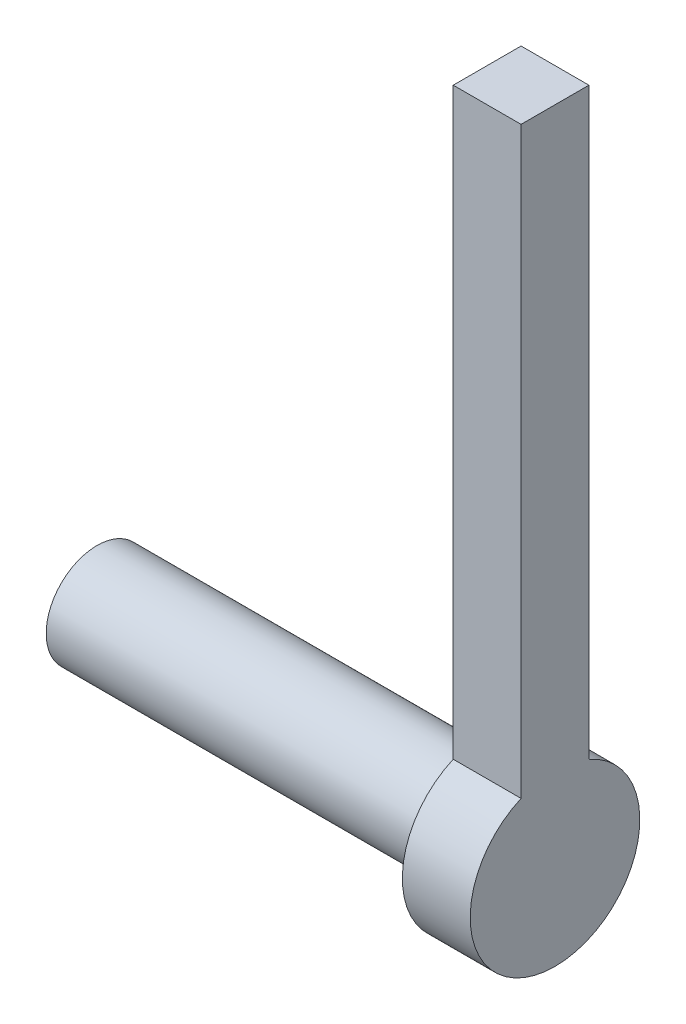
ISO-10303-21;
HEADER;
FILE_DESCRIPTION(('STEP AP214'),'2;1');
FILE_NAME('part.step','',(''),(''),'','','');
FILE_SCHEMA(('AUTOMOTIVE_DESIGN { 1 0 10303 214 1 1 1 1 }'));
ENDSEC;
DATA;
#1=APPLICATION_CONTEXT('core data for automotive mechanical design processes');
#2=APPLICATION_PROTOCOL_DEFINITION('international standard','automotive_design',2000,#1);
#3=PRODUCT_CONTEXT('',#1,'mechanical');
#4=PRODUCT('Part','Part','',(#3));
#5=PRODUCT_RELATED_PRODUCT_CATEGORY('part','',(#4));
#6=PRODUCT_DEFINITION_FORMATION('','',#4);
#7=PRODUCT_DEFINITION_CONTEXT('part definition',#1,'design');
#8=PRODUCT_DEFINITION('design','',#6,#7);
#9=PRODUCT_DEFINITION_SHAPE('','',#8);
#10=(LENGTH_UNIT() NAMED_UNIT(*) SI_UNIT(.MILLI.,.METRE.));
#11=(NAMED_UNIT(*) PLANE_ANGLE_UNIT() SI_UNIT($,.RADIAN.));
#12=(NAMED_UNIT(*) SI_UNIT($,.STERADIAN.) SOLID_ANGLE_UNIT());
#13=UNCERTAINTY_MEASURE_WITH_UNIT(LENGTH_MEASURE(1.E-05),#10,'distance_accuracy_value','');
#14=(GEOMETRIC_REPRESENTATION_CONTEXT(3) GLOBAL_UNCERTAINTY_ASSIGNED_CONTEXT((#13)) GLOBAL_UNIT_ASSIGNED_CONTEXT((#10,
#11,#12)) REPRESENTATION_CONTEXT('',''));
#15=CARTESIAN_POINT('',(0.,0.,0.));
#16=DIRECTION('',(0.,0.,1.));
#17=DIRECTION('',(1.,0.,0.));
#18=AXIS2_PLACEMENT_3D('',#15,#16,#17);
#19=CARTESIAN_POINT('',(-0.5,29.,-10.5));
#20=DIRECTION('',(-1.,0.,0.));
#21=DIRECTION('',(0.,0.,1.));
#22=AXIS2_PLACEMENT_3D('',#19,#20,#21);
#23=CYLINDRICAL_SURFACE('',#22,1.5);
#24=CARTESIAN_POINT('',(-0.5,29.,-10.5));
#25=DIRECTION('',(-1.,0.,0.));
#26=DIRECTION('',(0.,0.,-1.));
#27=AXIS2_PLACEMENT_3D('',#24,#25,#26);
#28=CIRCLE('',#27,1.5);
#29=CARTESIAN_POINT('',(-0.5,29.,-12.));
#30=VERTEX_POINT('',#29);
#31=EDGE_CURVE('E11',#30,#30,#28,.T.);
#32=ORIENTED_EDGE('',*,*,#31,.T.);
#33=EDGE_LOOP('',(#32));
#34=FACE_BOUND('',#33,.T.);
#35=CARTESIAN_POINT('',(-12.,29.,-10.5));
#36=DIRECTION('',(-1.,0.,0.));
#37=DIRECTION('',(0.,0.,-1.));
#38=AXIS2_PLACEMENT_3D('',#35,#36,#37);
#39=CIRCLE('',#38,1.5);
#40=CARTESIAN_POINT('',(-12.,29.,-12.));
#41=VERTEX_POINT('',#40);
#42=EDGE_CURVE('E42',#41,#41,#39,.T.);
#43=ORIENTED_EDGE('',*,*,#42,.F.);
#44=EDGE_LOOP('',(#43));
#45=FACE_BOUND('',#44,.T.);
#46=ADVANCED_FACE('F41',(#34,#45),#23,.T.);
#47=CARTESIAN_POINT('',(-12.,29.,-10.5));
#48=DIRECTION('',(1.,0.,0.));
#49=DIRECTION('',(0.,0.,-1.));
#50=AXIS2_PLACEMENT_3D('',#47,#48,#49);
#51=PLANE('',#50);
#52=ORIENTED_EDGE('',*,*,#42,.T.);
#53=EDGE_LOOP('',(#52));
#54=FACE_BOUND('',#53,.T.);
#55=ADVANCED_FACE('F121',(#54),#51,.F.);
#56=CARTESIAN_POINT('',(1.5,29.,-10.5));
#57=DIRECTION('',(-1.,0.,0.));
#58=DIRECTION('',(0.,0.,1.));
#59=AXIS2_PLACEMENT_3D('',#56,#57,#58);
#60=CYLINDRICAL_SURFACE('',#59,2.5);
#61=CARTESIAN_POINT('',(-0.5,29.,-10.5));
#62=DIRECTION('',(-1.,0.,0.));
#63=DIRECTION('',(0.,0.,-1.));
#64=AXIS2_PLACEMENT_3D('',#61,#62,#63);
#65=CIRCLE('',#64,2.5);
#66=CARTESIAN_POINT('',(-0.5,31.2912878474779,-11.5));
#67=VERTEX_POINT('',#66);
#68=CARTESIAN_POINT('',(-0.5,31.2912878474779,-9.5));
#69=VERTEX_POINT('',#68);
#70=EDGE_CURVE('E101',#67,#69,#65,.T.);
#71=ORIENTED_EDGE('',*,*,#70,.F.);
#72=DIRECTION('',(-1.,0.,0.));
#73=VECTOR('',#72,1.);
#74=CARTESIAN_POINT('',(1.5,31.2912878474779,-11.5));
#75=LINE('',#74,#73);
#76=CARTESIAN_POINT('',(1.5,31.2912878474779,-11.5));
#77=VERTEX_POINT('',#76);
#78=EDGE_CURVE('E92',#67,#77,#75,.F.);
#79=ORIENTED_EDGE('',*,*,#78,.T.);
#80=CARTESIAN_POINT('',(1.5,29.,-10.5));
#81=DIRECTION('',(-1.,0.,0.));
#82=DIRECTION('',(0.,0.,-1.));
#83=AXIS2_PLACEMENT_3D('',#80,#81,#82);
#84=CIRCLE('',#83,2.5);
#85=CARTESIAN_POINT('',(1.5,31.2912878474779,-9.5));
#86=VERTEX_POINT('',#85);
#87=EDGE_CURVE('E111',#77,#86,#84,.T.);
#88=ORIENTED_EDGE('',*,*,#87,.T.);
#89=DIRECTION('',(-1.,0.,0.));
#90=VECTOR('',#89,1.);
#91=CARTESIAN_POINT('',(1.5,31.2912878474779,-9.5));
#92=LINE('',#91,#90);
#93=EDGE_CURVE('E115',#69,#86,#92,.F.);
#94=ORIENTED_EDGE('',*,*,#93,.F.);
#95=EDGE_LOOP('',(#71,#79,#88,#94));
#96=FACE_BOUND('',#95,.T.);
#97=ADVANCED_FACE('F126',(#96),#60,.T.);
#98=CARTESIAN_POINT('',(1.5,29.,-10.5));
#99=DIRECTION('',(1.,0.,0.));
#100=DIRECTION('',(0.,0.,-1.));
#101=AXIS2_PLACEMENT_3D('',#98,#99,#100);
#102=PLANE('',#101);
#103=ORIENTED_EDGE('',*,*,#87,.F.);
#104=DIRECTION('',(0.,-1.,0.));
#105=VECTOR('',#104,1.);
#106=CARTESIAN_POINT('',(1.5,48.5,-11.5));
#107=LINE('',#106,#105);
#108=CARTESIAN_POINT('',(1.5,48.5,-11.5));
#109=VERTEX_POINT('',#108);
#110=EDGE_CURVE('E105',#109,#77,#107,.T.);
#111=ORIENTED_EDGE('',*,*,#110,.F.);
#112=DIRECTION('',(0.,0.,-1.));
#113=VECTOR('',#112,1.);
#114=CARTESIAN_POINT('',(1.5,48.5,-9.5));
#115=LINE('',#114,#113);
#116=CARTESIAN_POINT('',(1.5,48.5,-9.5));
#117=VERTEX_POINT('',#116);
#118=EDGE_CURVE('E96',#117,#109,#115,.T.);
#119=ORIENTED_EDGE('',*,*,#118,.F.);
#120=DIRECTION('',(0.,-1.,0.));
#121=VECTOR('',#120,1.);
#122=CARTESIAN_POINT('',(1.5,48.5,-9.5));
#123=LINE('',#122,#121);
#124=EDGE_CURVE('E54',#117,#86,#123,.T.);
#125=ORIENTED_EDGE('',*,*,#124,.T.);
#126=EDGE_LOOP('',(#103,#111,#119,#125));
#127=FACE_BOUND('',#126,.T.);
#128=ADVANCED_FACE('F132',(#127),#102,.T.);
#129=CARTESIAN_POINT('',(-0.5,29.,-10.5));
#130=DIRECTION('',(1.,0.,0.));
#131=DIRECTION('',(0.,0.,-1.));
#132=AXIS2_PLACEMENT_3D('',#129,#130,#131);
#133=PLANE('',#132);
#134=ORIENTED_EDGE('',*,*,#70,.T.);
#135=DIRECTION('',(0.,1.,0.));
#136=VECTOR('',#135,1.);
#137=CARTESIAN_POINT('',(-0.5,29.,-9.5));
#138=LINE('',#137,#136);
#139=CARTESIAN_POINT('',(-0.5,48.5,-9.5));
#140=VERTEX_POINT('',#139);
#141=EDGE_CURVE('E87',#69,#140,#138,.T.);
#142=ORIENTED_EDGE('',*,*,#141,.T.);
#143=DIRECTION('',(0.,0.,-1.));
#144=VECTOR('',#143,1.);
#145=CARTESIAN_POINT('',(-0.5,48.5,-9.5));
#146=LINE('',#145,#144);
#147=CARTESIAN_POINT('',(-0.5,48.5,-11.5));
#148=VERTEX_POINT('',#147);
#149=EDGE_CURVE('E95',#140,#148,#146,.T.);
#150=ORIENTED_EDGE('',*,*,#149,.T.);
#151=DIRECTION('',(0.,1.,0.));
#152=VECTOR('',#151,1.);
#153=CARTESIAN_POINT('',(-0.5,29.,-11.5));
#154=LINE('',#153,#152);
#155=EDGE_CURVE('E65',#67,#148,#154,.T.);
#156=ORIENTED_EDGE('',*,*,#155,.F.);
#157=EDGE_LOOP('',(#134,#142,#150,#156));
#158=FACE_BOUND('',#157,.T.);
#159=ORIENTED_EDGE('',*,*,#31,.F.);
#160=EDGE_LOOP('',(#159));
#161=FACE_BOUND('',#160,.T.);
#162=ADVANCED_FACE('F98',(#158,#161),#133,.F.);
#163=CARTESIAN_POINT('',(0.,0.,-9.5));
#164=DIRECTION('',(0.,0.,1.));
#165=DIRECTION('',(1.,0.,0.));
#166=AXIS2_PLACEMENT_3D('',#163,#164,#165);
#167=PLANE('',#166);
#168=ORIENTED_EDGE('',*,*,#93,.T.);
#169=ORIENTED_EDGE('',*,*,#124,.F.);
#170=DIRECTION('',(1.,0.,0.));
#171=VECTOR('',#170,1.);
#172=CARTESIAN_POINT('',(-0.5,48.5,-9.5));
#173=LINE('',#172,#171);
#174=EDGE_CURVE('E84',#140,#117,#173,.T.);
#175=ORIENTED_EDGE('',*,*,#174,.F.);
#176=ORIENTED_EDGE('',*,*,#141,.F.);
#177=EDGE_LOOP('',(#168,#169,#175,#176));
#178=FACE_BOUND('',#177,.T.);
#179=ADVANCED_FACE('F85',(#178),#167,.T.);
#180=CARTESIAN_POINT('',(0.,0.,-11.5));
#181=DIRECTION('',(0.,0.,1.));
#182=DIRECTION('',(1.,0.,0.));
#183=AXIS2_PLACEMENT_3D('',#180,#181,#182);
#184=PLANE('',#183);
#185=ORIENTED_EDGE('',*,*,#155,.T.);
#186=DIRECTION('',(1.,0.,0.));
#187=VECTOR('',#186,1.);
#188=CARTESIAN_POINT('',(-0.5,48.5,-11.5));
#189=LINE('',#188,#187);
#190=EDGE_CURVE('E94',#148,#109,#189,.T.);
#191=ORIENTED_EDGE('',*,*,#190,.T.);
#192=ORIENTED_EDGE('',*,*,#110,.T.);
#193=ORIENTED_EDGE('',*,*,#78,.F.);
#194=EDGE_LOOP('',(#185,#191,#192,#193));
#195=FACE_BOUND('',#194,.T.);
#196=ADVANCED_FACE('F137',(#195),#184,.F.);
#197=CARTESIAN_POINT('',(-0.5,48.5,-9.5));
#198=DIRECTION('',(0.,-1.,0.));
#199=DIRECTION('',(0.,0.,1.));
#200=AXIS2_PLACEMENT_3D('',#197,#198,#199);
#201=PLANE('',#200);
#202=ORIENTED_EDGE('',*,*,#190,.F.);
#203=ORIENTED_EDGE('',*,*,#149,.F.);
#204=ORIENTED_EDGE('',*,*,#174,.T.);
#205=ORIENTED_EDGE('',*,*,#118,.T.);
#206=EDGE_LOOP('',(#202,#203,#204,#205));
#207=FACE_BOUND('',#206,.T.);
#208=ADVANCED_FACE('F91',(#207),#201,.F.);
#209=CLOSED_SHELL('',(#46,#55,#97,#128,#162,#179,#196,#208));
#210=MANIFOLD_SOLID_BREP('B2',#209);
#211=ADVANCED_BREP_SHAPE_REPRESENTATION('',(#18,#210),#14);
#212=SHAPE_DEFINITION_REPRESENTATION(#9,#211);
ENDSEC;
END-ISO-10303-21;
